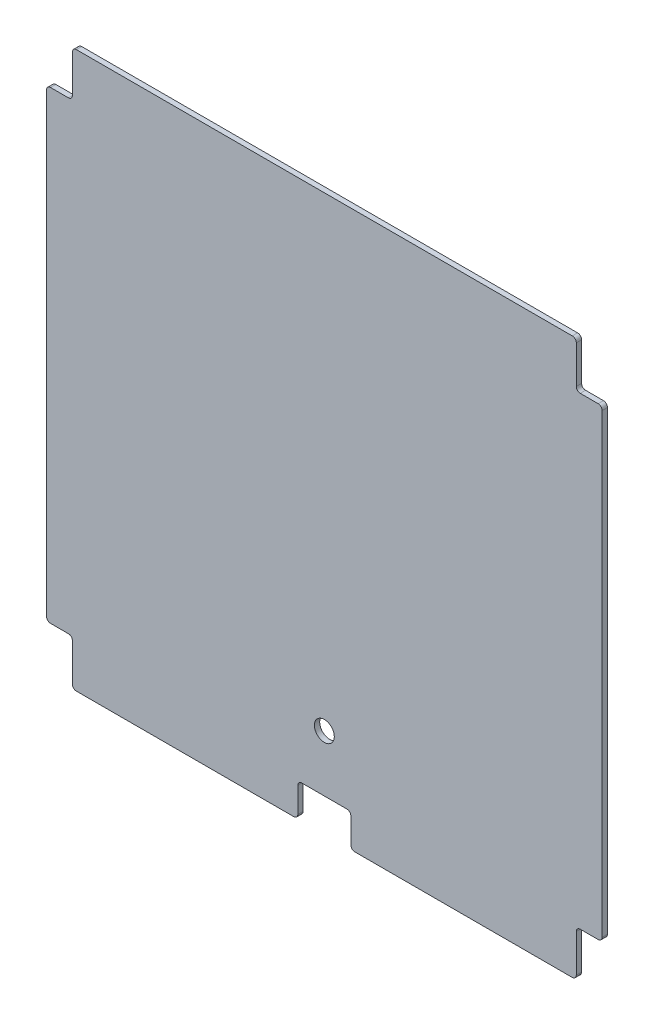
ISO-10303-21;
HEADER;
FILE_DESCRIPTION(('STEP AP214'),'2;1');
FILE_NAME('part.step','',(''),(''),'','','');
FILE_SCHEMA(('AUTOMOTIVE_DESIGN { 1 0 10303 214 1 1 1 1 }'));
ENDSEC;
DATA;
#1=APPLICATION_CONTEXT('core data for automotive mechanical design processes');
#2=APPLICATION_PROTOCOL_DEFINITION('international standard','automotive_design',2000,#1);
#3=PRODUCT_CONTEXT('',#1,'mechanical');
#4=PRODUCT('Part','Part','',(#3));
#5=PRODUCT_RELATED_PRODUCT_CATEGORY('part','',(#4));
#6=PRODUCT_DEFINITION_FORMATION('','',#4);
#7=PRODUCT_DEFINITION_CONTEXT('part definition',#1,'design');
#8=PRODUCT_DEFINITION('design','',#6,#7);
#9=PRODUCT_DEFINITION_SHAPE('','',#8);
#10=(LENGTH_UNIT() NAMED_UNIT(*) SI_UNIT(.MILLI.,.METRE.));
#11=(NAMED_UNIT(*) PLANE_ANGLE_UNIT() SI_UNIT($,.RADIAN.));
#12=(NAMED_UNIT(*) SI_UNIT($,.STERADIAN.) SOLID_ANGLE_UNIT());
#13=UNCERTAINTY_MEASURE_WITH_UNIT(LENGTH_MEASURE(1.E-05),#10,'distance_accuracy_value','');
#14=(GEOMETRIC_REPRESENTATION_CONTEXT(3) GLOBAL_UNCERTAINTY_ASSIGNED_CONTEXT((#13)) GLOBAL_UNIT_ASSIGNED_CONTEXT((#10,
#11,#12)) REPRESENTATION_CONTEXT('',''));
#15=CARTESIAN_POINT('',(0.,0.,0.));
#16=DIRECTION('',(0.,0.,1.));
#17=DIRECTION('',(1.,0.,0.));
#18=AXIS2_PLACEMENT_3D('',#15,#16,#17);
#19=CARTESIAN_POINT('',(-209.5,-209.5,4.));
#20=DIRECTION('',(0.,1.,0.));
#21=DIRECTION('',(0.,0.,1.));
#22=AXIS2_PLACEMENT_3D('',#19,#20,#21);
#23=PLANE('',#22);
#24=DIRECTION('',(1.,0.,0.));
#25=VECTOR('',#24,1.);
#26=CARTESIAN_POINT('',(-209.5,-209.5,0.));
#27=LINE('',#26,#25);
#28=CARTESIAN_POINT('',(-187.,-209.5,0.));
#29=VERTEX_POINT('',#28);
#30=CARTESIAN_POINT('',(-23.,-209.5,0.));
#31=VERTEX_POINT('',#30);
#32=EDGE_CURVE('E287',#29,#31,#27,.T.);
#33=ORIENTED_EDGE('',*,*,#32,.T.);
#34=DIRECTION('',(0.,0.,1.));
#35=VECTOR('',#34,1.);
#36=CARTESIAN_POINT('',(-23.,-209.5,4.));
#37=LINE('',#36,#35);
#38=CARTESIAN_POINT('',(-23.,-209.5,4.));
#39=VERTEX_POINT('',#38);
#40=EDGE_CURVE('E407',#31,#39,#37,.T.);
#41=ORIENTED_EDGE('',*,*,#40,.T.);
#42=DIRECTION('',(1.,0.,0.));
#43=VECTOR('',#42,1.);
#44=CARTESIAN_POINT('',(-209.5,-209.5,4.));
#45=LINE('',#44,#43);
#46=CARTESIAN_POINT('',(-187.,-209.5,4.));
#47=VERTEX_POINT('',#46);
#48=EDGE_CURVE('E295',#47,#39,#45,.T.);
#49=ORIENTED_EDGE('',*,*,#48,.F.);
#50=DIRECTION('',(0.,0.,1.));
#51=VECTOR('',#50,1.);
#52=CARTESIAN_POINT('',(-187.,-209.5,4.));
#53=LINE('',#52,#51);
#54=EDGE_CURVE('E405',#47,#29,#53,.F.);
#55=ORIENTED_EDGE('',*,*,#54,.T.);
#56=EDGE_LOOP('',(#33,#41,#49,#55));
#57=FACE_BOUND('',#56,.T.);
#58=ADVANCED_FACE('F37',(#57),#23,.F.);
#59=CARTESIAN_POINT('',(209.5,-209.5,4.));
#60=DIRECTION('',(-1.,0.,0.));
#61=DIRECTION('',(0.,0.,1.));
#62=AXIS2_PLACEMENT_3D('',#59,#60,#61);
#63=PLANE('',#62);
#64=DIRECTION('',(0.,1.,0.));
#65=VECTOR('',#64,1.);
#66=CARTESIAN_POINT('',(209.5,-209.5,0.));
#67=LINE('',#66,#65);
#68=CARTESIAN_POINT('',(209.5,-172.,0.));
#69=VERTEX_POINT('',#68);
#70=CARTESIAN_POINT('',(209.5,172.,0.));
#71=VERTEX_POINT('',#70);
#72=EDGE_CURVE('E296',#69,#71,#67,.T.);
#73=ORIENTED_EDGE('',*,*,#72,.T.);
#74=DIRECTION('',(0.,0.,1.));
#75=VECTOR('',#74,1.);
#76=CARTESIAN_POINT('',(209.5,172.,4.));
#77=LINE('',#76,#75);
#78=CARTESIAN_POINT('',(209.5,172.,4.));
#79=VERTEX_POINT('',#78);
#80=EDGE_CURVE('E363',#71,#79,#77,.T.);
#81=ORIENTED_EDGE('',*,*,#80,.T.);
#82=DIRECTION('',(0.,1.,0.));
#83=VECTOR('',#82,1.);
#84=CARTESIAN_POINT('',(209.5,-209.5,4.));
#85=LINE('',#84,#83);
#86=CARTESIAN_POINT('',(209.5,-172.,4.));
#87=VERTEX_POINT('',#86);
#88=EDGE_CURVE('E283',#87,#79,#85,.T.);
#89=ORIENTED_EDGE('',*,*,#88,.F.);
#90=DIRECTION('',(0.,0.,1.));
#91=VECTOR('',#90,1.);
#92=CARTESIAN_POINT('',(209.5,-172.,4.));
#93=LINE('',#92,#91);
#94=EDGE_CURVE('E361',#87,#69,#93,.F.);
#95=ORIENTED_EDGE('',*,*,#94,.T.);
#96=EDGE_LOOP('',(#73,#81,#89,#95));
#97=FACE_BOUND('',#96,.T.);
#98=ADVANCED_FACE('F556',(#97),#63,.F.);
#99=CARTESIAN_POINT('',(-209.5,209.5,4.));
#100=DIRECTION('',(0.,-1.,0.));
#101=DIRECTION('',(0.,0.,-1.));
#102=AXIS2_PLACEMENT_3D('',#99,#100,#101);
#103=PLANE('',#102);
#104=DIRECTION('',(-1.,0.,0.));
#105=VECTOR('',#104,1.);
#106=CARTESIAN_POINT('',(-209.5,209.5,0.));
#107=LINE('',#106,#105);
#108=CARTESIAN_POINT('',(187.,209.5,0.));
#109=VERTEX_POINT('',#108);
#110=CARTESIAN_POINT('',(-187.,209.5,0.));
#111=VERTEX_POINT('',#110);
#112=EDGE_CURVE('E299',#109,#111,#107,.T.);
#113=ORIENTED_EDGE('',*,*,#112,.T.);
#114=DIRECTION('',(0.,0.,1.));
#115=VECTOR('',#114,1.);
#116=CARTESIAN_POINT('',(-187.,209.5,4.));
#117=LINE('',#116,#115);
#118=CARTESIAN_POINT('',(-187.,209.5,4.));
#119=VERTEX_POINT('',#118);
#120=EDGE_CURVE('E358',#111,#119,#117,.T.);
#121=ORIENTED_EDGE('',*,*,#120,.T.);
#122=DIRECTION('',(-1.,0.,0.));
#123=VECTOR('',#122,1.);
#124=CARTESIAN_POINT('',(-209.5,209.5,4.));
#125=LINE('',#124,#123);
#126=CARTESIAN_POINT('',(187.,209.5,4.));
#127=VERTEX_POINT('',#126);
#128=EDGE_CURVE('E286',#127,#119,#125,.T.);
#129=ORIENTED_EDGE('',*,*,#128,.F.);
#130=DIRECTION('',(0.,0.,1.));
#131=VECTOR('',#130,1.);
#132=CARTESIAN_POINT('',(187.,209.5,4.));
#133=LINE('',#132,#131);
#134=EDGE_CURVE('E356',#127,#109,#133,.F.);
#135=ORIENTED_EDGE('',*,*,#134,.T.);
#136=EDGE_LOOP('',(#113,#121,#129,#135));
#137=FACE_BOUND('',#136,.T.);
#138=ADVANCED_FACE('F478',(#137),#103,.F.);
#139=CARTESIAN_POINT('',(-209.5,-209.5,4.));
#140=DIRECTION('',(1.,0.,0.));
#141=DIRECTION('',(0.,0.,-1.));
#142=AXIS2_PLACEMENT_3D('',#139,#140,#141);
#143=PLANE('',#142);
#144=DIRECTION('',(0.,-1.,0.));
#145=VECTOR('',#144,1.);
#146=CARTESIAN_POINT('',(-209.5,-209.5,4.));
#147=LINE('',#146,#145);
#148=CARTESIAN_POINT('',(-209.5,172.,4.));
#149=VERTEX_POINT('',#148);
#150=CARTESIAN_POINT('',(-209.5,-172.,4.));
#151=VERTEX_POINT('',#150);
#152=EDGE_CURVE('E289',#149,#151,#147,.T.);
#153=ORIENTED_EDGE('',*,*,#152,.F.);
#154=DIRECTION('',(0.,0.,1.));
#155=VECTOR('',#154,1.);
#156=CARTESIAN_POINT('',(-209.5,172.,4.));
#157=LINE('',#156,#155);
#158=CARTESIAN_POINT('',(-209.5,172.,0.));
#159=VERTEX_POINT('',#158);
#160=EDGE_CURVE('E334',#149,#159,#157,.F.);
#161=ORIENTED_EDGE('',*,*,#160,.T.);
#162=DIRECTION('',(0.,-1.,0.));
#163=VECTOR('',#162,1.);
#164=CARTESIAN_POINT('',(-209.5,-209.5,0.));
#165=LINE('',#164,#163);
#166=CARTESIAN_POINT('',(-209.5,-172.,0.));
#167=VERTEX_POINT('',#166);
#168=EDGE_CURVE('E302',#159,#167,#165,.T.);
#169=ORIENTED_EDGE('',*,*,#168,.T.);
#170=DIRECTION('',(0.,0.,1.));
#171=VECTOR('',#170,1.);
#172=CARTESIAN_POINT('',(-209.5,-172.,4.));
#173=LINE('',#172,#171);
#174=EDGE_CURVE('E331',#167,#151,#173,.T.);
#175=ORIENTED_EDGE('',*,*,#174,.T.);
#176=EDGE_LOOP('',(#153,#161,#169,#175));
#177=FACE_BOUND('',#176,.T.);
#178=ADVANCED_FACE('F567',(#177),#143,.F.);
#179=CARTESIAN_POINT('',(23.,-209.5,0.));
#180=VERTEX_POINT('',#179);
#181=CARTESIAN_POINT('',(187.,-209.5,0.));
#182=VERTEX_POINT('',#181);
#183=EDGE_CURVE('E305',#180,#182,#27,.T.);
#184=ORIENTED_EDGE('',*,*,#183,.T.);
#185=DIRECTION('',(0.,0.,1.));
#186=VECTOR('',#185,1.);
#187=CARTESIAN_POINT('',(187.,-209.5,4.));
#188=LINE('',#187,#186);
#189=CARTESIAN_POINT('',(187.,-209.5,4.));
#190=VERTEX_POINT('',#189);
#191=EDGE_CURVE('E388',#182,#190,#188,.T.);
#192=ORIENTED_EDGE('',*,*,#191,.T.);
#193=CARTESIAN_POINT('',(23.,-209.5,4.));
#194=VERTEX_POINT('',#193);
#195=EDGE_CURVE('E292',#194,#190,#45,.T.);
#196=ORIENTED_EDGE('',*,*,#195,.F.);
#197=DIRECTION('',(0.,0.,1.));
#198=VECTOR('',#197,1.);
#199=CARTESIAN_POINT('',(23.,-209.5,4.));
#200=LINE('',#199,#198);
#201=EDGE_CURVE('E386',#194,#180,#200,.F.);
#202=ORIENTED_EDGE('',*,*,#201,.T.);
#203=EDGE_LOOP('',(#184,#192,#196,#202));
#204=FACE_BOUND('',#203,.T.);
#205=ADVANCED_FACE('F558',(#204),#23,.F.);
#206=CARTESIAN_POINT('',(0.,0.,4.));
#207=DIRECTION('',(0.,0.,-1.));
#208=DIRECTION('',(-1.,0.,0.));
#209=AXIS2_PLACEMENT_3D('',#206,#207,#208);
#210=PLANE('',#209);
#211=CARTESIAN_POINT('',(0.,-142.,4.));
#212=DIRECTION('',(0.,0.,1.));
#213=DIRECTION('',(1.,0.,0.));
#214=AXIS2_PLACEMENT_3D('',#211,#212,#213);
#215=CIRCLE('',#214,7.5);
#216=CARTESIAN_POINT('',(7.5,-142.,4.));
#217=VERTEX_POINT('',#216);
#218=EDGE_CURVE('E509',#217,#217,#215,.T.);
#219=ORIENTED_EDGE('',*,*,#218,.F.);
#220=EDGE_LOOP('',(#219));
#221=FACE_BOUND('',#220,.T.);
#222=DIRECTION('',(1.,0.,0.));
#223=VECTOR('',#222,1.);
#224=CARTESIAN_POINT('',(-209.5,175.,4.));
#225=LINE('',#224,#223);
#226=CARTESIAN_POINT('',(-206.5,175.,4.));
#227=VERTEX_POINT('',#226);
#228=CARTESIAN_POINT('',(-193.,175.,4.));
#229=VERTEX_POINT('',#228);
#230=EDGE_CURVE('E275',#227,#229,#225,.T.);
#231=ORIENTED_EDGE('',*,*,#230,.F.);
#232=CARTESIAN_POINT('',(-206.5,172.,4.));
#233=DIRECTION('',(0.,0.,-1.));
#234=DIRECTION('',(-1.,0.,0.));
#235=AXIS2_PLACEMENT_3D('',#232,#233,#234);
#236=CIRCLE('',#235,3.);
#237=EDGE_CURVE('E329',#227,#149,#236,.F.);
#238=ORIENTED_EDGE('',*,*,#237,.T.);
#239=ORIENTED_EDGE('',*,*,#152,.T.);
#240=CARTESIAN_POINT('',(-206.5,-172.,4.));
#241=DIRECTION('',(0.,0.,-1.));
#242=DIRECTION('',(-1.,0.,0.));
#243=AXIS2_PLACEMENT_3D('',#240,#241,#242);
#244=CIRCLE('',#243,3.);
#245=CARTESIAN_POINT('',(-206.5,-175.,4.));
#246=VERTEX_POINT('',#245);
#247=EDGE_CURVE('E312',#151,#246,#244,.F.);
#248=ORIENTED_EDGE('',*,*,#247,.T.);
#249=DIRECTION('',(-1.,0.,0.));
#250=VECTOR('',#249,1.);
#251=CARTESIAN_POINT('',(-209.5,-175.,4.));
#252=LINE('',#251,#250);
#253=CARTESIAN_POINT('',(-193.,-175.,4.));
#254=VERTEX_POINT('',#253);
#255=EDGE_CURVE('E439',#254,#246,#252,.T.);
#256=ORIENTED_EDGE('',*,*,#255,.F.);
#257=CARTESIAN_POINT('',(-193.,-178.,4.));
#258=DIRECTION('',(0.,0.,-1.));
#259=DIRECTION('',(-1.,0.,0.));
#260=AXIS2_PLACEMENT_3D('',#257,#258,#259);
#261=CIRCLE('',#260,3.);
#262=CARTESIAN_POINT('',(-190.,-178.,4.));
#263=VERTEX_POINT('',#262);
#264=EDGE_CURVE('E45',#254,#263,#261,.T.);
#265=ORIENTED_EDGE('',*,*,#264,.T.);
#266=DIRECTION('',(0.,1.,0.));
#267=VECTOR('',#266,1.);
#268=CARTESIAN_POINT('',(-190.,-209.5,4.));
#269=LINE('',#268,#267);
#270=CARTESIAN_POINT('',(-190.,-206.5,4.));
#271=VERTEX_POINT('',#270);
#272=EDGE_CURVE('E437',#271,#263,#269,.T.);
#273=ORIENTED_EDGE('',*,*,#272,.F.);
#274=CARTESIAN_POINT('',(-187.,-206.5,4.));
#275=DIRECTION('',(0.,0.,-1.));
#276=DIRECTION('',(-1.,0.,0.));
#277=AXIS2_PLACEMENT_3D('',#274,#275,#276);
#278=CIRCLE('',#277,3.);
#279=EDGE_CURVE('E314',#271,#47,#278,.F.);
#280=ORIENTED_EDGE('',*,*,#279,.T.);
#281=ORIENTED_EDGE('',*,*,#48,.T.);
#282=CARTESIAN_POINT('',(-23.,-206.5,4.));
#283=DIRECTION('',(0.,0.,-1.));
#284=DIRECTION('',(-1.,0.,0.));
#285=AXIS2_PLACEMENT_3D('',#282,#283,#284);
#286=CIRCLE('',#285,3.);
#287=CARTESIAN_POINT('',(-20.,-206.5,4.));
#288=VERTEX_POINT('',#287);
#289=EDGE_CURVE('E316',#39,#288,#286,.F.);
#290=ORIENTED_EDGE('',*,*,#289,.T.);
#291=DIRECTION('',(0.,-1.,0.));
#292=VECTOR('',#291,1.);
#293=CARTESIAN_POINT('',(-20.,-209.5,4.));
#294=LINE('',#293,#292);
#295=CARTESIAN_POINT('',(-20.,-187.5,4.));
#296=VERTEX_POINT('',#295);
#297=EDGE_CURVE('E515',#296,#288,#294,.T.);
#298=ORIENTED_EDGE('',*,*,#297,.F.);
#299=CARTESIAN_POINT('',(-17.,-187.5,4.));
#300=DIRECTION('',(0.,0.,-1.));
#301=DIRECTION('',(-1.,0.,0.));
#302=AXIS2_PLACEMENT_3D('',#299,#300,#301);
#303=CIRCLE('',#302,3.);
#304=CARTESIAN_POINT('',(-17.,-184.5,4.));
#305=VERTEX_POINT('',#304);
#306=EDGE_CURVE('E431',#296,#305,#303,.T.);
#307=ORIENTED_EDGE('',*,*,#306,.T.);
#308=DIRECTION('',(-1.,0.,0.));
#309=VECTOR('',#308,1.);
#310=CARTESIAN_POINT('',(-20.,-184.5,4.));
#311=LINE('',#310,#309);
#312=CARTESIAN_POINT('',(17.,-184.5,4.));
#313=VERTEX_POINT('',#312);
#314=EDGE_CURVE('E516',#313,#305,#311,.T.);
#315=ORIENTED_EDGE('',*,*,#314,.F.);
#316=CARTESIAN_POINT('',(17.,-187.5,4.));
#317=DIRECTION('',(0.,0.,-1.));
#318=DIRECTION('',(-1.,0.,0.));
#319=AXIS2_PLACEMENT_3D('',#316,#317,#318);
#320=CIRCLE('',#319,3.);
#321=CARTESIAN_POINT('',(20.,-187.5,4.));
#322=VERTEX_POINT('',#321);
#323=EDGE_CURVE('E428',#313,#322,#320,.T.);
#324=ORIENTED_EDGE('',*,*,#323,.T.);
#325=DIRECTION('',(0.,1.,0.));
#326=VECTOR('',#325,1.);
#327=CARTESIAN_POINT('',(20.,-209.5,4.));
#328=LINE('',#327,#326);
#329=CARTESIAN_POINT('',(20.,-206.5,4.));
#330=VERTEX_POINT('',#329);
#331=EDGE_CURVE('E519',#330,#322,#328,.T.);
#332=ORIENTED_EDGE('',*,*,#331,.F.);
#333=CARTESIAN_POINT('',(23.,-206.5,4.));
#334=DIRECTION('',(0.,0.,-1.));
#335=DIRECTION('',(-1.,0.,0.));
#336=AXIS2_PLACEMENT_3D('',#333,#334,#335);
#337=CIRCLE('',#336,3.);
#338=EDGE_CURVE('E318',#330,#194,#337,.F.);
#339=ORIENTED_EDGE('',*,*,#338,.T.);
#340=ORIENTED_EDGE('',*,*,#195,.T.);
#341=CARTESIAN_POINT('',(187.,-206.5,4.));
#342=DIRECTION('',(0.,0.,-1.));
#343=DIRECTION('',(-1.,0.,0.));
#344=AXIS2_PLACEMENT_3D('',#341,#342,#343);
#345=CIRCLE('',#344,3.);
#346=CARTESIAN_POINT('',(190.,-206.5,4.));
#347=VERTEX_POINT('',#346);
#348=EDGE_CURVE('E320',#190,#347,#345,.F.);
#349=ORIENTED_EDGE('',*,*,#348,.T.);
#350=DIRECTION('',(0.,-1.,0.));
#351=VECTOR('',#350,1.);
#352=CARTESIAN_POINT('',(190.,-209.5,4.));
#353=LINE('',#352,#351);
#354=CARTESIAN_POINT('',(190.,-178.,4.));
#355=VERTEX_POINT('',#354);
#356=EDGE_CURVE('E497',#355,#347,#353,.T.);
#357=ORIENTED_EDGE('',*,*,#356,.F.);
#358=CARTESIAN_POINT('',(193.,-178.,4.));
#359=DIRECTION('',(0.,0.,-1.));
#360=DIRECTION('',(-1.,0.,0.));
#361=AXIS2_PLACEMENT_3D('',#358,#359,#360);
#362=CIRCLE('',#361,3.);
#363=CARTESIAN_POINT('',(193.,-175.,4.));
#364=VERTEX_POINT('',#363);
#365=EDGE_CURVE('E424',#355,#364,#362,.T.);
#366=ORIENTED_EDGE('',*,*,#365,.T.);
#367=DIRECTION('',(-1.,0.,0.));
#368=VECTOR('',#367,1.);
#369=CARTESIAN_POINT('',(209.5,-175.,4.));
#370=LINE('',#369,#368);
#371=CARTESIAN_POINT('',(206.5,-175.,4.));
#372=VERTEX_POINT('',#371);
#373=EDGE_CURVE('E501',#372,#364,#370,.T.);
#374=ORIENTED_EDGE('',*,*,#373,.F.);
#375=CARTESIAN_POINT('',(206.5,-172.,4.));
#376=DIRECTION('',(0.,0.,-1.));
#377=DIRECTION('',(-1.,0.,0.));
#378=AXIS2_PLACEMENT_3D('',#375,#376,#377);
#379=CIRCLE('',#378,3.);
#380=EDGE_CURVE('E322',#372,#87,#379,.F.);
#381=ORIENTED_EDGE('',*,*,#380,.T.);
#382=ORIENTED_EDGE('',*,*,#88,.T.);
#383=CARTESIAN_POINT('',(206.5,172.,4.));
#384=DIRECTION('',(0.,0.,-1.));
#385=DIRECTION('',(-1.,0.,0.));
#386=AXIS2_PLACEMENT_3D('',#383,#384,#385);
#387=CIRCLE('',#386,3.);
#388=CARTESIAN_POINT('',(206.5,175.,4.));
#389=VERTEX_POINT('',#388);
#390=EDGE_CURVE('E326',#79,#389,#387,.F.);
#391=ORIENTED_EDGE('',*,*,#390,.T.);
#392=DIRECTION('',(1.,0.,0.));
#393=VECTOR('',#392,1.);
#394=CARTESIAN_POINT('',(209.5,175.,4.));
#395=LINE('',#394,#393);
#396=CARTESIAN_POINT('',(193.,175.,4.));
#397=VERTEX_POINT('',#396);
#398=EDGE_CURVE('E466',#397,#389,#395,.T.);
#399=ORIENTED_EDGE('',*,*,#398,.F.);
#400=CARTESIAN_POINT('',(193.,178.,4.));
#401=DIRECTION('',(0.,0.,-1.));
#402=DIRECTION('',(-1.,0.,0.));
#403=AXIS2_PLACEMENT_3D('',#400,#401,#402);
#404=CIRCLE('',#403,3.);
#405=CARTESIAN_POINT('',(190.,178.,4.));
#406=VERTEX_POINT('',#405);
#407=EDGE_CURVE('E420',#397,#406,#404,.T.);
#408=ORIENTED_EDGE('',*,*,#407,.T.);
#409=DIRECTION('',(0.,-1.,0.));
#410=VECTOR('',#409,1.);
#411=CARTESIAN_POINT('',(190.,209.5,4.));
#412=LINE('',#411,#410);
#413=CARTESIAN_POINT('',(190.,206.5,4.));
#414=VERTEX_POINT('',#413);
#415=EDGE_CURVE('E463',#414,#406,#412,.T.);
#416=ORIENTED_EDGE('',*,*,#415,.F.);
#417=CARTESIAN_POINT('',(187.,206.5,4.));
#418=DIRECTION('',(0.,0.,-1.));
#419=DIRECTION('',(-1.,0.,0.));
#420=AXIS2_PLACEMENT_3D('',#417,#418,#419);
#421=CIRCLE('',#420,3.);
#422=EDGE_CURVE('E324',#414,#127,#421,.F.);
#423=ORIENTED_EDGE('',*,*,#422,.T.);
#424=ORIENTED_EDGE('',*,*,#128,.T.);
#425=CARTESIAN_POINT('',(-187.,206.5,4.));
#426=DIRECTION('',(0.,0.,-1.));
#427=DIRECTION('',(-1.,0.,0.));
#428=AXIS2_PLACEMENT_3D('',#425,#426,#427);
#429=CIRCLE('',#428,3.);
#430=CARTESIAN_POINT('',(-190.,206.5,4.));
#431=VERTEX_POINT('',#430);
#432=EDGE_CURVE('E273',#119,#431,#429,.F.);
#433=ORIENTED_EDGE('',*,*,#432,.T.);
#434=DIRECTION('',(0.,1.,0.));
#435=VECTOR('',#434,1.);
#436=CARTESIAN_POINT('',(-190.,209.5,4.));
#437=LINE('',#436,#435);
#438=CARTESIAN_POINT('',(-190.,178.,4.));
#439=VERTEX_POINT('',#438);
#440=EDGE_CURVE('E264',#439,#431,#437,.T.);
#441=ORIENTED_EDGE('',*,*,#440,.F.);
#442=CARTESIAN_POINT('',(-193.,178.,4.));
#443=DIRECTION('',(0.,0.,-1.));
#444=DIRECTION('',(-1.,0.,0.));
#445=AXIS2_PLACEMENT_3D('',#442,#443,#444);
#446=CIRCLE('',#445,3.);
#447=EDGE_CURVE('E247',#439,#229,#446,.T.);
#448=ORIENTED_EDGE('',*,*,#447,.T.);
#449=EDGE_LOOP('',(#231,#238,#239,#248,#256,#265,#273,#280,#281,#290,#298,#307,#315,#324,#332,
#339,#340,#349,#357,#366,#374,#381,#382,#391,#399,#408,#416,#423,#424,#433,#441,#448));
#450=FACE_BOUND('',#449,.T.);
#451=ADVANCED_FACE('F271',(#221,#450),#210,.F.);
#452=CARTESIAN_POINT('',(0.,0.,0.));
#453=DIRECTION('',(0.,0.,-1.));
#454=DIRECTION('',(-1.,0.,0.));
#455=AXIS2_PLACEMENT_3D('',#452,#453,#454);
#456=PLANE('',#455);
#457=ORIENTED_EDGE('',*,*,#168,.F.);
#458=CARTESIAN_POINT('',(-206.5,172.,0.));
#459=DIRECTION('',(0.,0.,-1.));
#460=DIRECTION('',(-1.,0.,0.));
#461=AXIS2_PLACEMENT_3D('',#458,#459,#460);
#462=CIRCLE('',#461,3.);
#463=CARTESIAN_POINT('',(-206.5,175.,0.));
#464=VERTEX_POINT('',#463);
#465=EDGE_CURVE('E354',#159,#464,#462,.T.);
#466=ORIENTED_EDGE('',*,*,#465,.T.);
#467=DIRECTION('',(1.,0.,0.));
#468=VECTOR('',#467,1.);
#469=CARTESIAN_POINT('',(-209.5,175.,0.));
#470=LINE('',#469,#468);
#471=CARTESIAN_POINT('',(-193.,175.,0.));
#472=VERTEX_POINT('',#471);
#473=EDGE_CURVE('E274',#464,#472,#470,.T.);
#474=ORIENTED_EDGE('',*,*,#473,.T.);
#475=CARTESIAN_POINT('',(-193.,178.,0.));
#476=DIRECTION('',(0.,0.,-1.));
#477=DIRECTION('',(-1.,0.,0.));
#478=AXIS2_PLACEMENT_3D('',#475,#476,#477);
#479=CIRCLE('',#478,3.);
#480=CARTESIAN_POINT('',(-190.,178.,0.));
#481=VERTEX_POINT('',#480);
#482=EDGE_CURVE('E257',#472,#481,#479,.F.);
#483=ORIENTED_EDGE('',*,*,#482,.T.);
#484=DIRECTION('',(0.,1.,0.));
#485=VECTOR('',#484,1.);
#486=CARTESIAN_POINT('',(-190.,209.5,0.));
#487=LINE('',#486,#485);
#488=CARTESIAN_POINT('',(-190.,206.5,0.));
#489=VERTEX_POINT('',#488);
#490=EDGE_CURVE('E267',#481,#489,#487,.T.);
#491=ORIENTED_EDGE('',*,*,#490,.T.);
#492=CARTESIAN_POINT('',(-187.,206.5,0.));
#493=DIRECTION('',(0.,0.,-1.));
#494=DIRECTION('',(-1.,0.,0.));
#495=AXIS2_PLACEMENT_3D('',#492,#493,#494);
#496=CIRCLE('',#495,3.);
#497=EDGE_CURVE('E352',#489,#111,#496,.T.);
#498=ORIENTED_EDGE('',*,*,#497,.T.);
#499=ORIENTED_EDGE('',*,*,#112,.F.);
#500=CARTESIAN_POINT('',(187.,206.5,0.));
#501=DIRECTION('',(0.,0.,-1.));
#502=DIRECTION('',(-1.,0.,0.));
#503=AXIS2_PLACEMENT_3D('',#500,#501,#502);
#504=CIRCLE('',#503,3.);
#505=CARTESIAN_POINT('',(190.,206.5,0.));
#506=VERTEX_POINT('',#505);
#507=EDGE_CURVE('E348',#109,#506,#504,.T.);
#508=ORIENTED_EDGE('',*,*,#507,.T.);
#509=DIRECTION('',(0.,-1.,0.));
#510=VECTOR('',#509,1.);
#511=CARTESIAN_POINT('',(190.,209.5,0.));
#512=LINE('',#511,#510);
#513=CARTESIAN_POINT('',(190.,178.,0.));
#514=VERTEX_POINT('',#513);
#515=EDGE_CURVE('E490',#506,#514,#512,.T.);
#516=ORIENTED_EDGE('',*,*,#515,.T.);
#517=CARTESIAN_POINT('',(193.,178.,0.));
#518=DIRECTION('',(0.,0.,-1.));
#519=DIRECTION('',(-1.,0.,0.));
#520=AXIS2_PLACEMENT_3D('',#517,#518,#519);
#521=CIRCLE('',#520,3.);
#522=CARTESIAN_POINT('',(193.,175.,0.));
#523=VERTEX_POINT('',#522);
#524=EDGE_CURVE('E422',#514,#523,#521,.F.);
#525=ORIENTED_EDGE('',*,*,#524,.T.);
#526=DIRECTION('',(1.,0.,0.));
#527=VECTOR('',#526,1.);
#528=CARTESIAN_POINT('',(209.5,175.,0.));
#529=LINE('',#528,#527);
#530=CARTESIAN_POINT('',(206.5,175.,0.));
#531=VERTEX_POINT('',#530);
#532=EDGE_CURVE('E279',#523,#531,#529,.T.);
#533=ORIENTED_EDGE('',*,*,#532,.T.);
#534=CARTESIAN_POINT('',(206.5,172.,0.));
#535=DIRECTION('',(0.,0.,-1.));
#536=DIRECTION('',(-1.,0.,0.));
#537=AXIS2_PLACEMENT_3D('',#534,#535,#536);
#538=CIRCLE('',#537,3.);
#539=EDGE_CURVE('E350',#531,#71,#538,.T.);
#540=ORIENTED_EDGE('',*,*,#539,.T.);
#541=ORIENTED_EDGE('',*,*,#72,.F.);
#542=CARTESIAN_POINT('',(206.5,-172.,0.));
#543=DIRECTION('',(0.,0.,-1.));
#544=DIRECTION('',(-1.,0.,0.));
#545=AXIS2_PLACEMENT_3D('',#542,#543,#544);
#546=CIRCLE('',#545,3.);
#547=CARTESIAN_POINT('',(206.5,-175.,0.));
#548=VERTEX_POINT('',#547);
#549=EDGE_CURVE('E346',#69,#548,#546,.T.);
#550=ORIENTED_EDGE('',*,*,#549,.T.);
#551=DIRECTION('',(-1.,0.,0.));
#552=VECTOR('',#551,1.);
#553=CARTESIAN_POINT('',(209.5,-175.,0.));
#554=LINE('',#553,#552);
#555=CARTESIAN_POINT('',(193.,-175.,0.));
#556=VERTEX_POINT('',#555);
#557=EDGE_CURVE('E500',#548,#556,#554,.T.);
#558=ORIENTED_EDGE('',*,*,#557,.T.);
#559=CARTESIAN_POINT('',(193.,-178.,0.));
#560=DIRECTION('',(0.,0.,-1.));
#561=DIRECTION('',(-1.,0.,0.));
#562=AXIS2_PLACEMENT_3D('',#559,#560,#561);
#563=CIRCLE('',#562,3.);
#564=CARTESIAN_POINT('',(190.,-178.,0.));
#565=VERTEX_POINT('',#564);
#566=EDGE_CURVE('E426',#556,#565,#563,.F.);
#567=ORIENTED_EDGE('',*,*,#566,.T.);
#568=DIRECTION('',(0.,-1.,0.));
#569=VECTOR('',#568,1.);
#570=CARTESIAN_POINT('',(190.,-209.5,0.));
#571=LINE('',#570,#569);
#572=CARTESIAN_POINT('',(190.,-206.5,0.));
#573=VERTEX_POINT('',#572);
#574=EDGE_CURVE('E448',#565,#573,#571,.T.);
#575=ORIENTED_EDGE('',*,*,#574,.T.);
#576=CARTESIAN_POINT('',(187.,-206.5,0.));
#577=DIRECTION('',(0.,0.,-1.));
#578=DIRECTION('',(-1.,0.,0.));
#579=AXIS2_PLACEMENT_3D('',#576,#577,#578);
#580=CIRCLE('',#579,3.);
#581=EDGE_CURVE('E344',#573,#182,#580,.T.);
#582=ORIENTED_EDGE('',*,*,#581,.T.);
#583=ORIENTED_EDGE('',*,*,#183,.F.);
#584=CARTESIAN_POINT('',(23.,-206.5,0.));
#585=DIRECTION('',(0.,0.,-1.));
#586=DIRECTION('',(-1.,0.,0.));
#587=AXIS2_PLACEMENT_3D('',#584,#585,#586);
#588=CIRCLE('',#587,3.);
#589=CARTESIAN_POINT('',(20.,-206.5,0.));
#590=VERTEX_POINT('',#589);
#591=EDGE_CURVE('E342',#180,#590,#588,.T.);
#592=ORIENTED_EDGE('',*,*,#591,.T.);
#593=DIRECTION('',(0.,1.,0.));
#594=VECTOR('',#593,1.);
#595=CARTESIAN_POINT('',(20.,-209.5,0.));
#596=LINE('',#595,#594);
#597=CARTESIAN_POINT('',(20.,-187.5,0.));
#598=VERTEX_POINT('',#597);
#599=EDGE_CURVE('E525',#590,#598,#596,.T.);
#600=ORIENTED_EDGE('',*,*,#599,.T.);
#601=CARTESIAN_POINT('',(17.,-187.5,0.));
#602=DIRECTION('',(0.,0.,-1.));
#603=DIRECTION('',(-1.,0.,0.));
#604=AXIS2_PLACEMENT_3D('',#601,#602,#603);
#605=CIRCLE('',#604,3.);
#606=CARTESIAN_POINT('',(17.,-184.5,0.));
#607=VERTEX_POINT('',#606);
#608=EDGE_CURVE('E59',#598,#607,#605,.F.);
#609=ORIENTED_EDGE('',*,*,#608,.T.);
#610=DIRECTION('',(-1.,0.,0.));
#611=VECTOR('',#610,1.);
#612=CARTESIAN_POINT('',(-20.,-184.5,0.));
#613=LINE('',#612,#611);
#614=CARTESIAN_POINT('',(-17.,-184.5,0.));
#615=VERTEX_POINT('',#614);
#616=EDGE_CURVE('E504',#607,#615,#613,.T.);
#617=ORIENTED_EDGE('',*,*,#616,.T.);
#618=CARTESIAN_POINT('',(-17.,-187.5,0.));
#619=DIRECTION('',(0.,0.,-1.));
#620=DIRECTION('',(-1.,0.,0.));
#621=AXIS2_PLACEMENT_3D('',#618,#619,#620);
#622=CIRCLE('',#621,3.);
#623=CARTESIAN_POINT('',(-20.,-187.5,0.));
#624=VERTEX_POINT('',#623);
#625=EDGE_CURVE('E433',#615,#624,#622,.F.);
#626=ORIENTED_EDGE('',*,*,#625,.T.);
#627=DIRECTION('',(0.,-1.,0.));
#628=VECTOR('',#627,1.);
#629=CARTESIAN_POINT('',(-20.,-209.5,0.));
#630=LINE('',#629,#628);
#631=CARTESIAN_POINT('',(-20.,-206.5,0.));
#632=VERTEX_POINT('',#631);
#633=EDGE_CURVE('E518',#624,#632,#630,.T.);
#634=ORIENTED_EDGE('',*,*,#633,.T.);
#635=CARTESIAN_POINT('',(-23.,-206.5,0.));
#636=DIRECTION('',(0.,0.,-1.));
#637=DIRECTION('',(-1.,0.,0.));
#638=AXIS2_PLACEMENT_3D('',#635,#636,#637);
#639=CIRCLE('',#638,3.);
#640=EDGE_CURVE('E340',#632,#31,#639,.T.);
#641=ORIENTED_EDGE('',*,*,#640,.T.);
#642=ORIENTED_EDGE('',*,*,#32,.F.);
#643=CARTESIAN_POINT('',(-187.,-206.5,0.));
#644=DIRECTION('',(0.,0.,-1.));
#645=DIRECTION('',(-1.,0.,0.));
#646=AXIS2_PLACEMENT_3D('',#643,#644,#645);
#647=CIRCLE('',#646,3.);
#648=CARTESIAN_POINT('',(-190.,-206.5,0.));
#649=VERTEX_POINT('',#648);
#650=EDGE_CURVE('E338',#29,#649,#647,.T.);
#651=ORIENTED_EDGE('',*,*,#650,.T.);
#652=DIRECTION('',(0.,1.,0.));
#653=VECTOR('',#652,1.);
#654=CARTESIAN_POINT('',(-190.,-209.5,0.));
#655=LINE('',#654,#653);
#656=CARTESIAN_POINT('',(-190.,-178.,0.));
#657=VERTEX_POINT('',#656);
#658=EDGE_CURVE('E459',#649,#657,#655,.T.);
#659=ORIENTED_EDGE('',*,*,#658,.T.);
#660=CARTESIAN_POINT('',(-193.,-178.,0.));
#661=DIRECTION('',(0.,0.,-1.));
#662=DIRECTION('',(-1.,0.,0.));
#663=AXIS2_PLACEMENT_3D('',#660,#661,#662);
#664=CIRCLE('',#663,3.);
#665=CARTESIAN_POINT('',(-193.,-175.,0.));
#666=VERTEX_POINT('',#665);
#667=EDGE_CURVE('E11',#657,#666,#664,.F.);
#668=ORIENTED_EDGE('',*,*,#667,.T.);
#669=DIRECTION('',(-1.,0.,0.));
#670=VECTOR('',#669,1.);
#671=CARTESIAN_POINT('',(-209.5,-175.,0.));
#672=LINE('',#671,#670);
#673=CARTESIAN_POINT('',(-206.5,-175.,0.));
#674=VERTEX_POINT('',#673);
#675=EDGE_CURVE('E457',#666,#674,#672,.T.);
#676=ORIENTED_EDGE('',*,*,#675,.T.);
#677=CARTESIAN_POINT('',(-206.5,-172.,0.));
#678=DIRECTION('',(0.,0.,-1.));
#679=DIRECTION('',(-1.,0.,0.));
#680=AXIS2_PLACEMENT_3D('',#677,#678,#679);
#681=CIRCLE('',#680,3.);
#682=EDGE_CURVE('E336',#674,#167,#681,.T.);
#683=ORIENTED_EDGE('',*,*,#682,.T.);
#684=EDGE_LOOP('',(#457,#466,#474,#483,#491,#498,#499,#508,#516,#525,#533,#540,#541,#550,#558,
#567,#575,#582,#583,#592,#600,#609,#617,#626,#634,#641,#642,#651,#659,#668,#676,#683));
#685=FACE_BOUND('',#684,.T.);
#686=CARTESIAN_POINT('',(0.,-142.,0.));
#687=DIRECTION('',(0.,0.,1.));
#688=DIRECTION('',(1.,0.,0.));
#689=AXIS2_PLACEMENT_3D('',#686,#687,#688);
#690=CIRCLE('',#689,7.5);
#691=CARTESIAN_POINT('',(7.5,-142.,0.));
#692=VERTEX_POINT('',#691);
#693=EDGE_CURVE('E512',#692,#692,#690,.T.);
#694=ORIENTED_EDGE('',*,*,#693,.T.);
#695=EDGE_LOOP('',(#694));
#696=FACE_BOUND('',#695,.T.);
#697=ADVANCED_FACE('F455',(#685,#696),#456,.T.);
#698=CARTESIAN_POINT('',(-190.,209.5,0.));
#699=DIRECTION('',(1.,0.,0.));
#700=DIRECTION('',(0.,0.,-1.));
#701=AXIS2_PLACEMENT_3D('',#698,#699,#700);
#702=PLANE('',#701);
#703=ORIENTED_EDGE('',*,*,#490,.F.);
#704=DIRECTION('',(0.,0.,1.));
#705=VECTOR('',#704,1.);
#706=CARTESIAN_POINT('',(-190.,178.,4.));
#707=LINE('',#706,#705);
#708=EDGE_CURVE('E251',#481,#439,#707,.T.);
#709=ORIENTED_EDGE('',*,*,#708,.T.);
#710=ORIENTED_EDGE('',*,*,#440,.T.);
#711=DIRECTION('',(0.,0.,1.));
#712=VECTOR('',#711,1.);
#713=CARTESIAN_POINT('',(-190.,206.5,0.));
#714=LINE('',#713,#712);
#715=EDGE_CURVE('E269',#431,#489,#714,.F.);
#716=ORIENTED_EDGE('',*,*,#715,.T.);
#717=EDGE_LOOP('',(#703,#709,#710,#716));
#718=FACE_BOUND('',#717,.T.);
#719=ADVANCED_FACE('F263',(#718),#702,.F.);
#720=CARTESIAN_POINT('',(-209.5,175.,0.));
#721=DIRECTION('',(0.,-1.,0.));
#722=DIRECTION('',(0.,0.,-1.));
#723=AXIS2_PLACEMENT_3D('',#720,#721,#722);
#724=PLANE('',#723);
#725=ORIENTED_EDGE('',*,*,#230,.T.);
#726=DIRECTION('',(0.,0.,1.));
#727=VECTOR('',#726,1.);
#728=CARTESIAN_POINT('',(-193.,175.,0.));
#729=LINE('',#728,#727);
#730=EDGE_CURVE('E252',#229,#472,#729,.F.);
#731=ORIENTED_EDGE('',*,*,#730,.T.);
#732=ORIENTED_EDGE('',*,*,#473,.F.);
#733=DIRECTION('',(0.,0.,1.));
#734=VECTOR('',#733,1.);
#735=CARTESIAN_POINT('',(-206.5,175.,0.));
#736=LINE('',#735,#734);
#737=EDGE_CURVE('E268',#464,#227,#736,.T.);
#738=ORIENTED_EDGE('',*,*,#737,.T.);
#739=EDGE_LOOP('',(#725,#731,#732,#738));
#740=FACE_BOUND('',#739,.T.);
#741=ADVANCED_FACE('F671',(#740),#724,.F.);
#742=CARTESIAN_POINT('',(190.,-209.5,0.));
#743=DIRECTION('',(-1.,0.,0.));
#744=DIRECTION('',(0.,0.,1.));
#745=AXIS2_PLACEMENT_3D('',#742,#743,#744);
#746=PLANE('',#745);
#747=ORIENTED_EDGE('',*,*,#574,.F.);
#748=DIRECTION('',(0.,0.,1.));
#749=VECTOR('',#748,1.);
#750=CARTESIAN_POINT('',(190.,-178.,4.));
#751=LINE('',#750,#749);
#752=EDGE_CURVE('E378',#565,#355,#751,.T.);
#753=ORIENTED_EDGE('',*,*,#752,.T.);
#754=ORIENTED_EDGE('',*,*,#356,.T.);
#755=DIRECTION('',(0.,0.,1.));
#756=VECTOR('',#755,1.);
#757=CARTESIAN_POINT('',(190.,-206.5,0.));
#758=LINE('',#757,#756);
#759=EDGE_CURVE('E376',#347,#573,#758,.F.);
#760=ORIENTED_EDGE('',*,*,#759,.T.);
#761=EDGE_LOOP('',(#747,#753,#754,#760));
#762=FACE_BOUND('',#761,.T.);
#763=ADVANCED_FACE('F588',(#762),#746,.F.);
#764=CARTESIAN_POINT('',(209.5,-175.,0.));
#765=DIRECTION('',(0.,1.,0.));
#766=DIRECTION('',(0.,0.,1.));
#767=AXIS2_PLACEMENT_3D('',#764,#765,#766);
#768=PLANE('',#767);
#769=ORIENTED_EDGE('',*,*,#373,.T.);
#770=DIRECTION('',(0.,0.,1.));
#771=VECTOR('',#770,1.);
#772=CARTESIAN_POINT('',(193.,-175.,0.));
#773=LINE('',#772,#771);
#774=EDGE_CURVE('E384',#364,#556,#773,.F.);
#775=ORIENTED_EDGE('',*,*,#774,.T.);
#776=ORIENTED_EDGE('',*,*,#557,.F.);
#777=DIRECTION('',(0.,0.,1.));
#778=VECTOR('',#777,1.);
#779=CARTESIAN_POINT('',(206.5,-175.,0.));
#780=LINE('',#779,#778);
#781=EDGE_CURVE('E381',#548,#372,#780,.T.);
#782=ORIENTED_EDGE('',*,*,#781,.T.);
#783=EDGE_LOOP('',(#769,#775,#776,#782));
#784=FACE_BOUND('',#783,.T.);
#785=ADVANCED_FACE('F596',(#784),#768,.F.);
#786=CARTESIAN_POINT('',(-209.5,-175.,0.));
#787=DIRECTION('',(0.,1.,0.));
#788=DIRECTION('',(0.,0.,1.));
#789=AXIS2_PLACEMENT_3D('',#786,#787,#788);
#790=PLANE('',#789);
#791=ORIENTED_EDGE('',*,*,#675,.F.);
#792=DIRECTION('',(0.,0.,1.));
#793=VECTOR('',#792,1.);
#794=CARTESIAN_POINT('',(-193.,-175.,4.));
#795=LINE('',#794,#793);
#796=EDGE_CURVE('E258',#666,#254,#795,.T.);
#797=ORIENTED_EDGE('',*,*,#796,.T.);
#798=ORIENTED_EDGE('',*,*,#255,.T.);
#799=DIRECTION('',(0.,0.,1.));
#800=VECTOR('',#799,1.);
#801=CARTESIAN_POINT('',(-206.5,-175.,0.));
#802=LINE('',#801,#800);
#803=EDGE_CURVE('E415',#246,#674,#802,.F.);
#804=ORIENTED_EDGE('',*,*,#803,.T.);
#805=EDGE_LOOP('',(#791,#797,#798,#804));
#806=FACE_BOUND('',#805,.T.);
#807=ADVANCED_FACE('F461',(#806),#790,.F.);
#808=CARTESIAN_POINT('',(-190.,-209.5,0.));
#809=DIRECTION('',(1.,0.,0.));
#810=DIRECTION('',(0.,0.,-1.));
#811=AXIS2_PLACEMENT_3D('',#808,#809,#810);
#812=PLANE('',#811);
#813=ORIENTED_EDGE('',*,*,#658,.F.);
#814=DIRECTION('',(0.,0.,1.));
#815=VECTOR('',#814,1.);
#816=CARTESIAN_POINT('',(-190.,-206.5,0.));
#817=LINE('',#816,#815);
#818=EDGE_CURVE('E412',#649,#271,#817,.T.);
#819=ORIENTED_EDGE('',*,*,#818,.T.);
#820=ORIENTED_EDGE('',*,*,#272,.T.);
#821=DIRECTION('',(0.,0.,1.));
#822=VECTOR('',#821,1.);
#823=CARTESIAN_POINT('',(-190.,-178.,0.));
#824=LINE('',#823,#822);
#825=EDGE_CURVE('E410',#263,#657,#824,.F.);
#826=ORIENTED_EDGE('',*,*,#825,.T.);
#827=EDGE_LOOP('',(#813,#819,#820,#826));
#828=FACE_BOUND('',#827,.T.);
#829=ADVANCED_FACE('F445',(#828),#812,.F.);
#830=CARTESIAN_POINT('',(209.5,175.,0.));
#831=DIRECTION('',(0.,-1.,0.));
#832=DIRECTION('',(0.,0.,-1.));
#833=AXIS2_PLACEMENT_3D('',#830,#831,#832);
#834=PLANE('',#833);
#835=ORIENTED_EDGE('',*,*,#398,.T.);
#836=DIRECTION('',(0.,0.,1.));
#837=VECTOR('',#836,1.);
#838=CARTESIAN_POINT('',(206.5,175.,0.));
#839=LINE('',#838,#837);
#840=EDGE_CURVE('E369',#389,#531,#839,.F.);
#841=ORIENTED_EDGE('',*,*,#840,.T.);
#842=ORIENTED_EDGE('',*,*,#532,.F.);
#843=DIRECTION('',(0.,0.,1.));
#844=VECTOR('',#843,1.);
#845=CARTESIAN_POINT('',(193.,175.,4.));
#846=LINE('',#845,#844);
#847=EDGE_CURVE('E366',#523,#397,#846,.T.);
#848=ORIENTED_EDGE('',*,*,#847,.T.);
#849=EDGE_LOOP('',(#835,#841,#842,#848));
#850=FACE_BOUND('',#849,.T.);
#851=ADVANCED_FACE('F612',(#850),#834,.F.);
#852=CARTESIAN_POINT('',(190.,209.5,0.));
#853=DIRECTION('',(-1.,0.,0.));
#854=DIRECTION('',(0.,0.,1.));
#855=AXIS2_PLACEMENT_3D('',#852,#853,#854);
#856=PLANE('',#855);
#857=ORIENTED_EDGE('',*,*,#515,.F.);
#858=DIRECTION('',(0.,0.,1.));
#859=VECTOR('',#858,1.);
#860=CARTESIAN_POINT('',(190.,206.5,0.));
#861=LINE('',#860,#859);
#862=EDGE_CURVE('E373',#506,#414,#861,.T.);
#863=ORIENTED_EDGE('',*,*,#862,.T.);
#864=ORIENTED_EDGE('',*,*,#415,.T.);
#865=DIRECTION('',(0.,0.,1.));
#866=VECTOR('',#865,1.);
#867=CARTESIAN_POINT('',(190.,178.,0.));
#868=LINE('',#867,#866);
#869=EDGE_CURVE('E371',#406,#514,#868,.F.);
#870=ORIENTED_EDGE('',*,*,#869,.T.);
#871=EDGE_LOOP('',(#857,#863,#864,#870));
#872=FACE_BOUND('',#871,.T.);
#873=ADVANCED_FACE('F487',(#872),#856,.F.);
#874=CARTESIAN_POINT('',(0.,-142.,0.));
#875=DIRECTION('',(0.,0.,1.));
#876=DIRECTION('',(1.,0.,0.));
#877=AXIS2_PLACEMENT_3D('',#874,#875,#876);
#878=CYLINDRICAL_SURFACE('',#877,7.5);
#879=ORIENTED_EDGE('',*,*,#693,.F.);
#880=EDGE_LOOP('',(#879));
#881=FACE_BOUND('',#880,.T.);
#882=ORIENTED_EDGE('',*,*,#218,.T.);
#883=EDGE_LOOP('',(#882));
#884=FACE_BOUND('',#883,.T.);
#885=ADVANCED_FACE('F665',(#881,#884),#878,.F.);
#886=CARTESIAN_POINT('',(-20.,-209.5,0.));
#887=DIRECTION('',(-1.,0.,0.));
#888=DIRECTION('',(0.,0.,1.));
#889=AXIS2_PLACEMENT_3D('',#886,#887,#888);
#890=PLANE('',#889);
#891=ORIENTED_EDGE('',*,*,#633,.F.);
#892=DIRECTION('',(0.,0.,1.));
#893=VECTOR('',#892,1.);
#894=CARTESIAN_POINT('',(-20.,-187.5,4.));
#895=LINE('',#894,#893);
#896=EDGE_CURVE('E402',#624,#296,#895,.T.);
#897=ORIENTED_EDGE('',*,*,#896,.T.);
#898=ORIENTED_EDGE('',*,*,#297,.T.);
#899=DIRECTION('',(0.,0.,1.));
#900=VECTOR('',#899,1.);
#901=CARTESIAN_POINT('',(-20.,-206.5,0.));
#902=LINE('',#901,#900);
#903=EDGE_CURVE('E400',#288,#632,#902,.F.);
#904=ORIENTED_EDGE('',*,*,#903,.T.);
#905=EDGE_LOOP('',(#891,#897,#898,#904));
#906=FACE_BOUND('',#905,.T.);
#907=ADVANCED_FACE('F643',(#906),#890,.F.);
#908=CARTESIAN_POINT('',(-20.,-184.5,0.));
#909=DIRECTION('',(0.,1.,0.));
#910=DIRECTION('',(0.,0.,1.));
#911=AXIS2_PLACEMENT_3D('',#908,#909,#910);
#912=PLANE('',#911);
#913=ORIENTED_EDGE('',*,*,#616,.F.);
#914=DIRECTION('',(0.,0.,1.));
#915=VECTOR('',#914,1.);
#916=CARTESIAN_POINT('',(17.,-184.5,4.));
#917=LINE('',#916,#915);
#918=EDGE_CURVE('E397',#607,#313,#917,.T.);
#919=ORIENTED_EDGE('',*,*,#918,.T.);
#920=ORIENTED_EDGE('',*,*,#314,.T.);
#921=DIRECTION('',(0.,0.,1.));
#922=VECTOR('',#921,1.);
#923=CARTESIAN_POINT('',(-17.,-184.5,0.));
#924=LINE('',#923,#922);
#925=EDGE_CURVE('E52',#305,#615,#924,.F.);
#926=ORIENTED_EDGE('',*,*,#925,.T.);
#927=EDGE_LOOP('',(#913,#919,#920,#926));
#928=FACE_BOUND('',#927,.T.);
#929=ADVANCED_FACE('F645',(#928),#912,.F.);
#930=CARTESIAN_POINT('',(20.,-209.5,0.));
#931=DIRECTION('',(1.,0.,0.));
#932=DIRECTION('',(0.,0.,-1.));
#933=AXIS2_PLACEMENT_3D('',#930,#931,#932);
#934=PLANE('',#933);
#935=ORIENTED_EDGE('',*,*,#599,.F.);
#936=DIRECTION('',(0.,0.,1.));
#937=VECTOR('',#936,1.);
#938=CARTESIAN_POINT('',(20.,-206.5,0.));
#939=LINE('',#938,#937);
#940=EDGE_CURVE('E393',#590,#330,#939,.T.);
#941=ORIENTED_EDGE('',*,*,#940,.T.);
#942=ORIENTED_EDGE('',*,*,#331,.T.);
#943=DIRECTION('',(0.,0.,1.));
#944=VECTOR('',#943,1.);
#945=CARTESIAN_POINT('',(20.,-187.5,0.));
#946=LINE('',#945,#944);
#947=EDGE_CURVE('E391',#322,#598,#946,.F.);
#948=ORIENTED_EDGE('',*,*,#947,.T.);
#949=EDGE_LOOP('',(#935,#941,#942,#948));
#950=FACE_BOUND('',#949,.T.);
#951=ADVANCED_FACE('F651',(#950),#934,.F.);
#952=CARTESIAN_POINT('',(-193.,178.,0.));
#953=DIRECTION('',(0.,0.,-1.));
#954=DIRECTION('',(-1.,0.,0.));
#955=AXIS2_PLACEMENT_3D('',#952,#953,#954);
#956=CYLINDRICAL_SURFACE('',#955,3.);
#957=ORIENTED_EDGE('',*,*,#482,.F.);
#958=ORIENTED_EDGE('',*,*,#730,.F.);
#959=ORIENTED_EDGE('',*,*,#447,.F.);
#960=ORIENTED_EDGE('',*,*,#708,.F.);
#961=EDGE_LOOP('',(#957,#958,#959,#960));
#962=FACE_BOUND('',#961,.T.);
#963=ADVANCED_FACE('F250',(#962),#956,.F.);
#964=CARTESIAN_POINT('',(-206.5,172.,0.));
#965=DIRECTION('',(0.,0.,1.));
#966=DIRECTION('',(1.,0.,0.));
#967=AXIS2_PLACEMENT_3D('',#964,#965,#966);
#968=CYLINDRICAL_SURFACE('',#967,3.);
#969=ORIENTED_EDGE('',*,*,#465,.F.);
#970=ORIENTED_EDGE('',*,*,#160,.F.);
#971=ORIENTED_EDGE('',*,*,#237,.F.);
#972=ORIENTED_EDGE('',*,*,#737,.F.);
#973=EDGE_LOOP('',(#969,#970,#971,#972));
#974=FACE_BOUND('',#973,.T.);
#975=ADVANCED_FACE('F659',(#974),#968,.T.);
#976=CARTESIAN_POINT('',(-187.,206.5,4.));
#977=DIRECTION('',(0.,0.,1.));
#978=DIRECTION('',(1.,0.,0.));
#979=AXIS2_PLACEMENT_3D('',#976,#977,#978);
#980=CYLINDRICAL_SURFACE('',#979,3.);
#981=ORIENTED_EDGE('',*,*,#497,.F.);
#982=ORIENTED_EDGE('',*,*,#715,.F.);
#983=ORIENTED_EDGE('',*,*,#432,.F.);
#984=ORIENTED_EDGE('',*,*,#120,.F.);
#985=EDGE_LOOP('',(#981,#982,#983,#984));
#986=FACE_BOUND('',#985,.T.);
#987=ADVANCED_FACE('F475',(#986),#980,.T.);
#988=CARTESIAN_POINT('',(206.5,172.,4.));
#989=DIRECTION('',(0.,0.,1.));
#990=DIRECTION('',(1.,0.,0.));
#991=AXIS2_PLACEMENT_3D('',#988,#989,#990);
#992=CYLINDRICAL_SURFACE('',#991,3.);
#993=ORIENTED_EDGE('',*,*,#539,.F.);
#994=ORIENTED_EDGE('',*,*,#840,.F.);
#995=ORIENTED_EDGE('',*,*,#390,.F.);
#996=ORIENTED_EDGE('',*,*,#80,.F.);
#997=EDGE_LOOP('',(#993,#994,#995,#996));
#998=FACE_BOUND('',#997,.T.);
#999=ADVANCED_FACE('F608',(#998),#992,.T.);
#1000=CARTESIAN_POINT('',(187.,206.5,0.));
#1001=DIRECTION('',(0.,0.,1.));
#1002=DIRECTION('',(1.,0.,0.));
#1003=AXIS2_PLACEMENT_3D('',#1000,#1001,#1002);
#1004=CYLINDRICAL_SURFACE('',#1003,3.);
#1005=ORIENTED_EDGE('',*,*,#507,.F.);
#1006=ORIENTED_EDGE('',*,*,#134,.F.);
#1007=ORIENTED_EDGE('',*,*,#422,.F.);
#1008=ORIENTED_EDGE('',*,*,#862,.F.);
#1009=EDGE_LOOP('',(#1005,#1006,#1007,#1008));
#1010=FACE_BOUND('',#1009,.T.);
#1011=ADVANCED_FACE('F484',(#1010),#1004,.T.);
#1012=CARTESIAN_POINT('',(193.,178.,0.));
#1013=DIRECTION('',(0.,0.,-1.));
#1014=DIRECTION('',(-1.,0.,0.));
#1015=AXIS2_PLACEMENT_3D('',#1012,#1013,#1014);
#1016=CYLINDRICAL_SURFACE('',#1015,3.);
#1017=ORIENTED_EDGE('',*,*,#524,.F.);
#1018=ORIENTED_EDGE('',*,*,#869,.F.);
#1019=ORIENTED_EDGE('',*,*,#407,.F.);
#1020=ORIENTED_EDGE('',*,*,#847,.F.);
#1021=EDGE_LOOP('',(#1017,#1018,#1019,#1020));
#1022=FACE_BOUND('',#1021,.T.);
#1023=ADVANCED_FACE('F616',(#1022),#1016,.F.);
#1024=CARTESIAN_POINT('',(193.,-178.,0.));
#1025=DIRECTION('',(0.,0.,-1.));
#1026=DIRECTION('',(-1.,0.,0.));
#1027=AXIS2_PLACEMENT_3D('',#1024,#1025,#1026);
#1028=CYLINDRICAL_SURFACE('',#1027,3.);
#1029=ORIENTED_EDGE('',*,*,#566,.F.);
#1030=ORIENTED_EDGE('',*,*,#774,.F.);
#1031=ORIENTED_EDGE('',*,*,#365,.F.);
#1032=ORIENTED_EDGE('',*,*,#752,.F.);
#1033=EDGE_LOOP('',(#1029,#1030,#1031,#1032));
#1034=FACE_BOUND('',#1033,.T.);
#1035=ADVANCED_FACE('F592',(#1034),#1028,.F.);
#1036=CARTESIAN_POINT('',(206.5,-172.,0.));
#1037=DIRECTION('',(0.,0.,1.));
#1038=DIRECTION('',(1.,0.,0.));
#1039=AXIS2_PLACEMENT_3D('',#1036,#1037,#1038);
#1040=CYLINDRICAL_SURFACE('',#1039,3.);
#1041=ORIENTED_EDGE('',*,*,#549,.F.);
#1042=ORIENTED_EDGE('',*,*,#94,.F.);
#1043=ORIENTED_EDGE('',*,*,#380,.F.);
#1044=ORIENTED_EDGE('',*,*,#781,.F.);
#1045=EDGE_LOOP('',(#1041,#1042,#1043,#1044));
#1046=FACE_BOUND('',#1045,.T.);
#1047=ADVANCED_FACE('F601',(#1046),#1040,.T.);
#1048=CARTESIAN_POINT('',(187.,-206.5,4.));
#1049=DIRECTION('',(0.,0.,1.));
#1050=DIRECTION('',(1.,0.,0.));
#1051=AXIS2_PLACEMENT_3D('',#1048,#1049,#1050);
#1052=CYLINDRICAL_SURFACE('',#1051,3.);
#1053=ORIENTED_EDGE('',*,*,#581,.F.);
#1054=ORIENTED_EDGE('',*,*,#759,.F.);
#1055=ORIENTED_EDGE('',*,*,#348,.F.);
#1056=ORIENTED_EDGE('',*,*,#191,.F.);
#1057=EDGE_LOOP('',(#1053,#1054,#1055,#1056));
#1058=FACE_BOUND('',#1057,.T.);
#1059=ADVANCED_FACE('F583',(#1058),#1052,.T.);
#1060=CARTESIAN_POINT('',(23.,-206.5,0.));
#1061=DIRECTION('',(0.,0.,1.));
#1062=DIRECTION('',(1.,0.,0.));
#1063=AXIS2_PLACEMENT_3D('',#1060,#1061,#1062);
#1064=CYLINDRICAL_SURFACE('',#1063,3.);
#1065=ORIENTED_EDGE('',*,*,#591,.F.);
#1066=ORIENTED_EDGE('',*,*,#201,.F.);
#1067=ORIENTED_EDGE('',*,*,#338,.F.);
#1068=ORIENTED_EDGE('',*,*,#940,.F.);
#1069=EDGE_LOOP('',(#1065,#1066,#1067,#1068));
#1070=FACE_BOUND('',#1069,.T.);
#1071=ADVANCED_FACE('F631',(#1070),#1064,.T.);
#1072=CARTESIAN_POINT('',(17.,-187.5,0.));
#1073=DIRECTION('',(0.,0.,-1.));
#1074=DIRECTION('',(-1.,0.,0.));
#1075=AXIS2_PLACEMENT_3D('',#1072,#1073,#1074);
#1076=CYLINDRICAL_SURFACE('',#1075,3.);
#1077=ORIENTED_EDGE('',*,*,#608,.F.);
#1078=ORIENTED_EDGE('',*,*,#947,.F.);
#1079=ORIENTED_EDGE('',*,*,#323,.F.);
#1080=ORIENTED_EDGE('',*,*,#918,.F.);
#1081=EDGE_LOOP('',(#1077,#1078,#1079,#1080));
#1082=FACE_BOUND('',#1081,.T.);
#1083=ADVANCED_FACE('F634',(#1082),#1076,.F.);
#1084=CARTESIAN_POINT('',(-17.,-187.5,0.));
#1085=DIRECTION('',(0.,0.,-1.));
#1086=DIRECTION('',(-1.,0.,0.));
#1087=AXIS2_PLACEMENT_3D('',#1084,#1085,#1086);
#1088=CYLINDRICAL_SURFACE('',#1087,3.);
#1089=ORIENTED_EDGE('',*,*,#625,.F.);
#1090=ORIENTED_EDGE('',*,*,#925,.F.);
#1091=ORIENTED_EDGE('',*,*,#306,.F.);
#1092=ORIENTED_EDGE('',*,*,#896,.F.);
#1093=EDGE_LOOP('',(#1089,#1090,#1091,#1092));
#1094=FACE_BOUND('',#1093,.T.);
#1095=ADVANCED_FACE('F553',(#1094),#1088,.F.);
#1096=CARTESIAN_POINT('',(-23.,-206.5,4.));
#1097=DIRECTION('',(0.,0.,1.));
#1098=DIRECTION('',(1.,0.,0.));
#1099=AXIS2_PLACEMENT_3D('',#1096,#1097,#1098);
#1100=CYLINDRICAL_SURFACE('',#1099,3.);
#1101=ORIENTED_EDGE('',*,*,#640,.F.);
#1102=ORIENTED_EDGE('',*,*,#903,.F.);
#1103=ORIENTED_EDGE('',*,*,#289,.F.);
#1104=ORIENTED_EDGE('',*,*,#40,.F.);
#1105=EDGE_LOOP('',(#1101,#1102,#1103,#1104));
#1106=FACE_BOUND('',#1105,.T.);
#1107=ADVANCED_FACE('F538',(#1106),#1100,.T.);
#1108=CARTESIAN_POINT('',(-187.,-206.5,0.));
#1109=DIRECTION('',(0.,0.,1.));
#1110=DIRECTION('',(1.,0.,0.));
#1111=AXIS2_PLACEMENT_3D('',#1108,#1109,#1110);
#1112=CYLINDRICAL_SURFACE('',#1111,3.);
#1113=ORIENTED_EDGE('',*,*,#650,.F.);
#1114=ORIENTED_EDGE('',*,*,#54,.F.);
#1115=ORIENTED_EDGE('',*,*,#279,.F.);
#1116=ORIENTED_EDGE('',*,*,#818,.F.);
#1117=EDGE_LOOP('',(#1113,#1114,#1115,#1116));
#1118=FACE_BOUND('',#1117,.T.);
#1119=ADVANCED_FACE('F546',(#1118),#1112,.T.);
#1120=CARTESIAN_POINT('',(-193.,-178.,0.));
#1121=DIRECTION('',(0.,0.,-1.));
#1122=DIRECTION('',(-1.,0.,0.));
#1123=AXIS2_PLACEMENT_3D('',#1120,#1121,#1122);
#1124=CYLINDRICAL_SURFACE('',#1123,3.);
#1125=ORIENTED_EDGE('',*,*,#667,.F.);
#1126=ORIENTED_EDGE('',*,*,#825,.F.);
#1127=ORIENTED_EDGE('',*,*,#264,.F.);
#1128=ORIENTED_EDGE('',*,*,#796,.F.);
#1129=EDGE_LOOP('',(#1125,#1126,#1127,#1128));
#1130=FACE_BOUND('',#1129,.T.);
#1131=ADVANCED_FACE('F451',(#1130),#1124,.F.);
#1132=CARTESIAN_POINT('',(-206.5,-172.,4.));
#1133=DIRECTION('',(0.,0.,1.));
#1134=DIRECTION('',(1.,0.,0.));
#1135=AXIS2_PLACEMENT_3D('',#1132,#1133,#1134);
#1136=CYLINDRICAL_SURFACE('',#1135,3.);
#1137=ORIENTED_EDGE('',*,*,#682,.F.);
#1138=ORIENTED_EDGE('',*,*,#803,.F.);
#1139=ORIENTED_EDGE('',*,*,#247,.F.);
#1140=ORIENTED_EDGE('',*,*,#174,.F.);
#1141=EDGE_LOOP('',(#1137,#1138,#1139,#1140));
#1142=FACE_BOUND('',#1141,.T.);
#1143=ADVANCED_FACE('F39',(#1142),#1136,.T.);
#1144=CLOSED_SHELL('',(#58,#98,#138,#178,#205,#451,#697,#719,#741,#763,#785,#807,#829,#851,#873,
#885,#907,#929,#951,#963,#975,#987,#999,#1011,#1023,#1035,#1047,#1059,#1071,#1083,#1095,#1107,
#1119,#1131,#1143));
#1145=MANIFOLD_SOLID_BREP('B2',#1144);
#1146=ADVANCED_BREP_SHAPE_REPRESENTATION('',(#18,#1145),#14);
#1147=SHAPE_DEFINITION_REPRESENTATION(#9,#1146);
ENDSEC;
END-ISO-10303-21;
